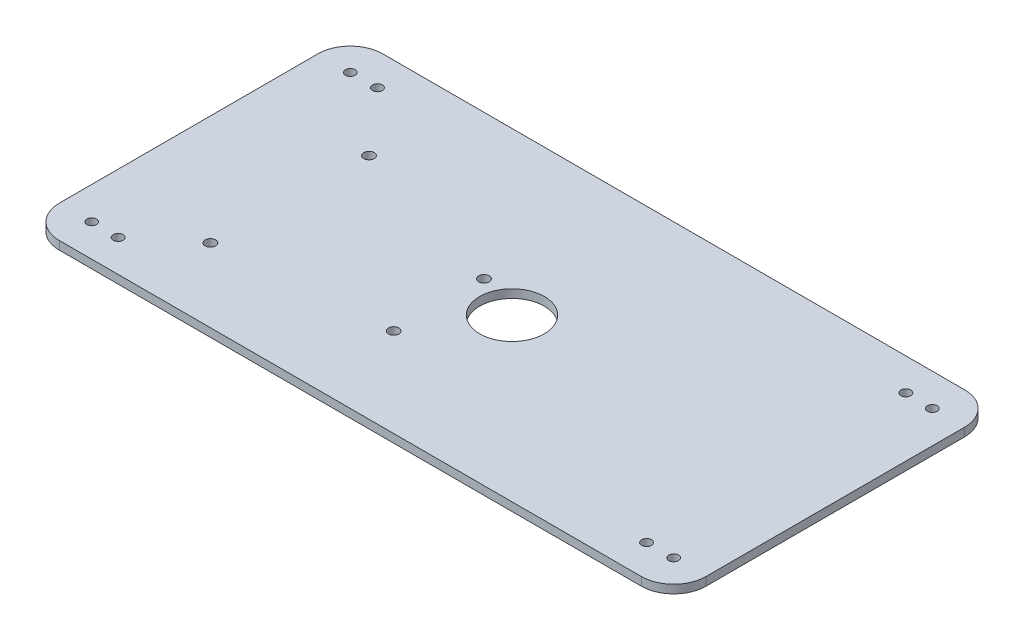
ISO-10303-21;
HEADER;
FILE_DESCRIPTION(('STEP AP214'),'2;1');
FILE_NAME('part.step','',(''),(''),'','','');
FILE_SCHEMA(('AUTOMOTIVE_DESIGN { 1 0 10303 214 1 1 1 1 }'));
ENDSEC;
DATA;
#1=APPLICATION_CONTEXT('core data for automotive mechanical design processes');
#2=APPLICATION_PROTOCOL_DEFINITION('international standard','automotive_design',2000,#1);
#3=PRODUCT_CONTEXT('',#1,'mechanical');
#4=PRODUCT('Part','Part','',(#3));
#5=PRODUCT_RELATED_PRODUCT_CATEGORY('part','',(#4));
#6=PRODUCT_DEFINITION_FORMATION('','',#4);
#7=PRODUCT_DEFINITION_CONTEXT('part definition',#1,'design');
#8=PRODUCT_DEFINITION('design','',#6,#7);
#9=PRODUCT_DEFINITION_SHAPE('','',#8);
#10=(LENGTH_UNIT() NAMED_UNIT(*) SI_UNIT(.MILLI.,.METRE.));
#11=(NAMED_UNIT(*) PLANE_ANGLE_UNIT() SI_UNIT($,.RADIAN.));
#12=(NAMED_UNIT(*) SI_UNIT($,.STERADIAN.) SOLID_ANGLE_UNIT());
#13=UNCERTAINTY_MEASURE_WITH_UNIT(LENGTH_MEASURE(1.E-05),#10,'distance_accuracy_value','');
#14=(GEOMETRIC_REPRESENTATION_CONTEXT(3) GLOBAL_UNCERTAINTY_ASSIGNED_CONTEXT((#13)) GLOBAL_UNIT_ASSIGNED_CONTEXT((#10,
#11,#12)) REPRESENTATION_CONTEXT('',''));
#15=CARTESIAN_POINT('',(0.,0.,0.));
#16=DIRECTION('',(0.,0.,1.));
#17=DIRECTION('',(1.,0.,0.));
#18=AXIS2_PLACEMENT_3D('',#15,#16,#17);
#19=CARTESIAN_POINT('',(0.,2.6,0.));
#20=DIRECTION('',(1.,0.,0.));
#21=DIRECTION('',(0.,0.,-1.));
#22=AXIS2_PLACEMENT_3D('',#19,#20,#21);
#23=PLANE('',#22);
#24=DIRECTION('',(0.,0.,1.));
#25=VECTOR('',#24,1.);
#26=CARTESIAN_POINT('',(0.,2.6,0.));
#27=LINE('',#26,#25);
#28=CARTESIAN_POINT('',(0.,2.6,10.));
#29=VERTEX_POINT('',#28);
#30=CARTESIAN_POINT('',(0.,2.6,90.));
#31=VERTEX_POINT('',#30);
#32=EDGE_CURVE('E121',#29,#31,#27,.T.);
#33=ORIENTED_EDGE('',*,*,#32,.F.);
#34=DIRECTION('',(0.,-1.,0.));
#35=VECTOR('',#34,1.);
#36=CARTESIAN_POINT('',(0.,0.,10.));
#37=LINE('',#36,#35);
#38=CARTESIAN_POINT('',(0.,0.,10.));
#39=VERTEX_POINT('',#38);
#40=EDGE_CURVE('E106',#29,#39,#37,.T.);
#41=ORIENTED_EDGE('',*,*,#40,.T.);
#42=DIRECTION('',(0.,0.,1.));
#43=VECTOR('',#42,1.);
#44=CARTESIAN_POINT('',(0.,0.,0.));
#45=LINE('',#44,#43);
#46=CARTESIAN_POINT('',(0.,0.,90.));
#47=VERTEX_POINT('',#46);
#48=EDGE_CURVE('E118',#39,#47,#45,.T.);
#49=ORIENTED_EDGE('',*,*,#48,.T.);
#50=DIRECTION('',(0.,-1.,0.));
#51=VECTOR('',#50,1.);
#52=CARTESIAN_POINT('',(0.,2.6,90.));
#53=LINE('',#52,#51);
#54=EDGE_CURVE('E123',#47,#31,#53,.F.);
#55=ORIENTED_EDGE('',*,*,#54,.T.);
#56=EDGE_LOOP('',(#33,#41,#49,#55));
#57=FACE_BOUND('',#56,.T.);
#58=ADVANCED_FACE('F35',(#57),#23,.F.);
#59=CARTESIAN_POINT('',(0.,2.6,100.));
#60=DIRECTION('',(0.,0.,-1.));
#61=DIRECTION('',(-1.,0.,0.));
#62=AXIS2_PLACEMENT_3D('',#59,#60,#61);
#63=PLANE('',#62);
#64=DIRECTION('',(1.,0.,0.));
#65=VECTOR('',#64,1.);
#66=CARTESIAN_POINT('',(0.,2.6,100.));
#67=LINE('',#66,#65);
#68=CARTESIAN_POINT('',(10.,2.6,100.));
#69=VERTEX_POINT('',#68);
#70=CARTESIAN_POINT('',(190.,2.6,100.));
#71=VERTEX_POINT('',#70);
#72=EDGE_CURVE('E169',#69,#71,#67,.T.);
#73=ORIENTED_EDGE('',*,*,#72,.F.);
#74=DIRECTION('',(0.,-1.,0.));
#75=VECTOR('',#74,1.);
#76=CARTESIAN_POINT('',(10.,2.6,100.));
#77=LINE('',#76,#75);
#78=CARTESIAN_POINT('',(10.,0.,100.));
#79=VERTEX_POINT('',#78);
#80=EDGE_CURVE('E161',#69,#79,#77,.T.);
#81=ORIENTED_EDGE('',*,*,#80,.T.);
#82=DIRECTION('',(1.,0.,0.));
#83=VECTOR('',#82,1.);
#84=CARTESIAN_POINT('',(0.,0.,100.));
#85=LINE('',#84,#83);
#86=CARTESIAN_POINT('',(190.,0.,100.));
#87=VERTEX_POINT('',#86);
#88=EDGE_CURVE('E127',#79,#87,#85,.T.);
#89=ORIENTED_EDGE('',*,*,#88,.T.);
#90=DIRECTION('',(0.,-1.,0.));
#91=VECTOR('',#90,1.);
#92=CARTESIAN_POINT('',(190.,2.6,100.));
#93=LINE('',#92,#91);
#94=EDGE_CURVE('E159',#87,#71,#93,.F.);
#95=ORIENTED_EDGE('',*,*,#94,.T.);
#96=EDGE_LOOP('',(#73,#81,#89,#95));
#97=FACE_BOUND('',#96,.T.);
#98=ADVANCED_FACE('F167',(#97),#63,.F.);
#99=CARTESIAN_POINT('',(200.,2.6,0.));
#100=DIRECTION('',(1.,0.,0.));
#101=DIRECTION('',(0.,0.,-1.));
#102=AXIS2_PLACEMENT_3D('',#99,#100,#101);
#103=PLANE('',#102);
#104=DIRECTION('',(0.,0.,1.));
#105=VECTOR('',#104,1.);
#106=CARTESIAN_POINT('',(200.,2.6,0.));
#107=LINE('',#106,#105);
#108=CARTESIAN_POINT('',(200.,2.6,10.));
#109=VERTEX_POINT('',#108);
#110=CARTESIAN_POINT('',(200.,2.6,90.));
#111=VERTEX_POINT('',#110);
#112=EDGE_CURVE('E176',#109,#111,#107,.T.);
#113=ORIENTED_EDGE('',*,*,#112,.T.);
#114=DIRECTION('',(0.,-1.,0.));
#115=VECTOR('',#114,1.);
#116=CARTESIAN_POINT('',(200.,0.,90.));
#117=LINE('',#116,#115);
#118=CARTESIAN_POINT('',(200.,0.,90.));
#119=VERTEX_POINT('',#118);
#120=EDGE_CURVE('E11',#111,#119,#117,.T.);
#121=ORIENTED_EDGE('',*,*,#120,.T.);
#122=DIRECTION('',(0.,0.,1.));
#123=VECTOR('',#122,1.);
#124=CARTESIAN_POINT('',(200.,0.,0.));
#125=LINE('',#124,#123);
#126=CARTESIAN_POINT('',(200.,0.,10.));
#127=VERTEX_POINT('',#126);
#128=EDGE_CURVE('E131',#127,#119,#125,.T.);
#129=ORIENTED_EDGE('',*,*,#128,.F.);
#130=DIRECTION('',(0.,-1.,0.));
#131=VECTOR('',#130,1.);
#132=CARTESIAN_POINT('',(200.,2.6,10.));
#133=LINE('',#132,#131);
#134=EDGE_CURVE('E44',#127,#109,#133,.F.);
#135=ORIENTED_EDGE('',*,*,#134,.T.);
#136=EDGE_LOOP('',(#113,#121,#129,#135));
#137=FACE_BOUND('',#136,.T.);
#138=ADVANCED_FACE('F175',(#137),#103,.T.);
#139=CARTESIAN_POINT('',(0.,2.6,0.));
#140=DIRECTION('',(0.,0.,-1.));
#141=DIRECTION('',(-1.,0.,0.));
#142=AXIS2_PLACEMENT_3D('',#139,#140,#141);
#143=PLANE('',#142);
#144=DIRECTION('',(1.,0.,0.));
#145=VECTOR('',#144,1.);
#146=CARTESIAN_POINT('',(0.,0.,0.));
#147=LINE('',#146,#145);
#148=CARTESIAN_POINT('',(10.,0.,0.));
#149=VERTEX_POINT('',#148);
#150=CARTESIAN_POINT('',(190.,0.,0.));
#151=VERTEX_POINT('',#150);
#152=EDGE_CURVE('E142',#149,#151,#147,.T.);
#153=ORIENTED_EDGE('',*,*,#152,.F.);
#154=DIRECTION('',(0.,-1.,0.));
#155=VECTOR('',#154,1.);
#156=CARTESIAN_POINT('',(10.,2.6,0.));
#157=LINE('',#156,#155);
#158=CARTESIAN_POINT('',(10.,2.6,0.));
#159=VERTEX_POINT('',#158);
#160=EDGE_CURVE('E107',#149,#159,#157,.F.);
#161=ORIENTED_EDGE('',*,*,#160,.T.);
#162=DIRECTION('',(1.,0.,0.));
#163=VECTOR('',#162,1.);
#164=CARTESIAN_POINT('',(0.,2.6,0.));
#165=LINE('',#164,#163);
#166=CARTESIAN_POINT('',(190.,2.6,0.));
#167=VERTEX_POINT('',#166);
#168=EDGE_CURVE('E137',#159,#167,#165,.T.);
#169=ORIENTED_EDGE('',*,*,#168,.T.);
#170=DIRECTION('',(0.,-1.,0.));
#171=VECTOR('',#170,1.);
#172=CARTESIAN_POINT('',(190.,2.6,0.));
#173=LINE('',#172,#171);
#174=EDGE_CURVE('E112',#167,#151,#173,.T.);
#175=ORIENTED_EDGE('',*,*,#174,.T.);
#176=EDGE_LOOP('',(#153,#161,#169,#175));
#177=FACE_BOUND('',#176,.T.);
#178=ADVANCED_FACE('F433',(#177),#143,.T.);
#179=CARTESIAN_POINT('',(0.,2.6,0.));
#180=DIRECTION('',(0.,1.,0.));
#181=DIRECTION('',(0.,0.,1.));
#182=AXIS2_PLACEMENT_3D('',#179,#180,#181);
#183=PLANE('',#182);
#184=CARTESIAN_POINT('',(18.288,2.6,90.094));
#185=DIRECTION('',(0.,-1.,0.));
#186=DIRECTION('',(0.,0.,-1.));
#187=AXIS2_PLACEMENT_3D('',#184,#185,#186);
#188=CIRCLE('',#187,1.524);
#189=CARTESIAN_POINT('',(18.288,2.6,88.57));
#190=VERTEX_POINT('',#189);
#191=EDGE_CURVE('E248',#190,#190,#188,.T.);
#192=ORIENTED_EDGE('',*,*,#191,.T.);
#193=EDGE_LOOP('',(#192));
#194=FACE_BOUND('',#193,.T.);
#195=CARTESIAN_POINT('',(181.712,2.6,90.094));
#196=DIRECTION('',(0.,1.,0.));
#197=DIRECTION('',(0.,0.,-1.));
#198=AXIS2_PLACEMENT_3D('',#195,#196,#197);
#199=CIRCLE('',#198,1.524);
#200=CARTESIAN_POINT('',(181.712,2.6,88.57));
#201=VERTEX_POINT('',#200);
#202=EDGE_CURVE('E242',#201,#201,#199,.T.);
#203=ORIENTED_EDGE('',*,*,#202,.F.);
#204=EDGE_LOOP('',(#203));
#205=FACE_BOUND('',#204,.T.);
#206=CARTESIAN_POINT('',(181.712,2.6,9.90599999999999));
#207=DIRECTION('',(0.,-1.,0.));
#208=DIRECTION('',(0.,0.,1.));
#209=AXIS2_PLACEMENT_3D('',#206,#207,#208);
#210=CIRCLE('',#209,1.524);
#211=CARTESIAN_POINT('',(181.712,2.6,11.43));
#212=VERTEX_POINT('',#211);
#213=EDGE_CURVE('E236',#212,#212,#210,.T.);
#214=ORIENTED_EDGE('',*,*,#213,.T.);
#215=EDGE_LOOP('',(#214));
#216=FACE_BOUND('',#215,.T.);
#217=CARTESIAN_POINT('',(18.288,2.6,9.906));
#218=DIRECTION('',(0.,1.,0.));
#219=DIRECTION('',(0.,0.,1.));
#220=AXIS2_PLACEMENT_3D('',#217,#218,#219);
#221=CIRCLE('',#220,1.524);
#222=CARTESIAN_POINT('',(18.288,2.6,11.43));
#223=VERTEX_POINT('',#222);
#224=EDGE_CURVE('E230',#223,#223,#221,.T.);
#225=ORIENTED_EDGE('',*,*,#224,.F.);
#226=EDGE_LOOP('',(#225));
#227=FACE_BOUND('',#226,.T.);
#228=CARTESIAN_POINT('',(100.,2.6,50.));
#229=DIRECTION('',(0.,-1.,0.));
#230=DIRECTION('',(0.,0.,-1.));
#231=AXIS2_PLACEMENT_3D('',#228,#229,#230);
#232=CIRCLE('',#231,9.99999999999999);
#233=CARTESIAN_POINT('',(100.,2.6,40.));
#234=VERTEX_POINT('',#233);
#235=EDGE_CURVE('E221',#234,#234,#232,.T.);
#236=ORIENTED_EDGE('',*,*,#235,.T.);
#237=EDGE_LOOP('',(#236));
#238=FACE_BOUND('',#237,.T.);
#239=CARTESIAN_POINT('',(85.94475,2.6,72.53875));
#240=DIRECTION('',(0.,1.,0.));
#241=DIRECTION('',(0.,0.,1.));
#242=AXIS2_PLACEMENT_3D('',#239,#240,#241);
#243=CIRCLE('',#242,1.61925);
#244=CARTESIAN_POINT('',(85.94475,2.6,74.158));
#245=VERTEX_POINT('',#244);
#246=EDGE_CURVE('E218',#245,#245,#243,.T.);
#247=ORIENTED_EDGE('',*,*,#246,.F.);
#248=EDGE_LOOP('',(#247));
#249=FACE_BOUND('',#248,.T.);
#250=CARTESIAN_POINT('',(34.01445,2.6,77.28855));
#251=DIRECTION('',(0.,1.,0.));
#252=DIRECTION('',(0.,0.,1.));
#253=AXIS2_PLACEMENT_3D('',#250,#251,#252);
#254=CIRCLE('',#253,1.61925);
#255=CARTESIAN_POINT('',(34.01445,2.6,78.9078));
#256=VERTEX_POINT('',#255);
#257=EDGE_CURVE('E212',#256,#256,#254,.T.);
#258=ORIENTED_EDGE('',*,*,#257,.F.);
#259=EDGE_LOOP('',(#258));
#260=FACE_BOUND('',#259,.T.);
#261=CARTESIAN_POINT('',(85.94475,2.6,44.61145));
#262=DIRECTION('',(0.,1.,0.));
#263=DIRECTION('',(0.,0.,1.));
#264=AXIS2_PLACEMENT_3D('',#261,#262,#263);
#265=CIRCLE('',#264,1.61925);
#266=CARTESIAN_POINT('',(85.94475,2.6,46.2307));
#267=VERTEX_POINT('',#266);
#268=EDGE_CURVE('E206',#267,#267,#265,.T.);
#269=ORIENTED_EDGE('',*,*,#268,.F.);
#270=EDGE_LOOP('',(#269));
#271=FACE_BOUND('',#270,.T.);
#272=CARTESIAN_POINT('',(35.15745,2.6,29.37145));
#273=DIRECTION('',(0.,1.,0.));
#274=DIRECTION('',(0.,0.,1.));
#275=AXIS2_PLACEMENT_3D('',#272,#273,#274);
#276=CIRCLE('',#275,1.61924999999999);
#277=CARTESIAN_POINT('',(35.15745,2.6,30.9907));
#278=VERTEX_POINT('',#277);
#279=EDGE_CURVE('E202',#278,#278,#276,.T.);
#280=ORIENTED_EDGE('',*,*,#279,.F.);
#281=EDGE_LOOP('',(#280));
#282=FACE_BOUND('',#281,.T.);
#283=CARTESIAN_POINT('',(190.,2.6,90.));
#284=DIRECTION('',(0.,1.,0.));
#285=DIRECTION('',(0.,0.,1.));
#286=AXIS2_PLACEMENT_3D('',#283,#284,#285);
#287=CIRCLE('',#286,1.5);
#288=CARTESIAN_POINT('',(190.,2.6,91.5));
#289=VERTEX_POINT('',#288);
#290=EDGE_CURVE('E194',#289,#289,#287,.T.);
#291=ORIENTED_EDGE('',*,*,#290,.F.);
#292=EDGE_LOOP('',(#291));
#293=FACE_BOUND('',#292,.T.);
#294=CARTESIAN_POINT('',(10.,2.6,90.));
#295=DIRECTION('',(0.,-1.,0.));
#296=DIRECTION('',(0.,0.,1.));
#297=AXIS2_PLACEMENT_3D('',#294,#295,#296);
#298=CIRCLE('',#297,1.5);
#299=CARTESIAN_POINT('',(10.,2.6,91.5));
#300=VERTEX_POINT('',#299);
#301=EDGE_CURVE('E188',#300,#300,#298,.T.);
#302=ORIENTED_EDGE('',*,*,#301,.T.);
#303=EDGE_LOOP('',(#302));
#304=FACE_BOUND('',#303,.T.);
#305=CARTESIAN_POINT('',(10.,2.6,10.));
#306=DIRECTION('',(0.,1.,0.));
#307=DIRECTION('',(0.,0.,-1.));
#308=AXIS2_PLACEMENT_3D('',#305,#306,#307);
#309=CIRCLE('',#308,1.5);
#310=CARTESIAN_POINT('',(10.,2.6,8.50000000000001));
#311=VERTEX_POINT('',#310);
#312=EDGE_CURVE('E183',#311,#311,#309,.T.);
#313=ORIENTED_EDGE('',*,*,#312,.F.);
#314=EDGE_LOOP('',(#313));
#315=FACE_BOUND('',#314,.T.);
#316=CARTESIAN_POINT('',(190.,2.6,10.));
#317=DIRECTION('',(0.,-1.,0.));
#318=DIRECTION('',(0.,0.,-1.));
#319=AXIS2_PLACEMENT_3D('',#316,#317,#318);
#320=CIRCLE('',#319,1.5);
#321=CARTESIAN_POINT('',(190.,2.6,8.5));
#322=VERTEX_POINT('',#321);
#323=EDGE_CURVE('E128',#322,#322,#320,.T.);
#324=ORIENTED_EDGE('',*,*,#323,.T.);
#325=EDGE_LOOP('',(#324));
#326=FACE_BOUND('',#325,.T.);
#327=ORIENTED_EDGE('',*,*,#168,.F.);
#328=CARTESIAN_POINT('',(10.,2.6,10.));
#329=DIRECTION('',(0.,1.,0.));
#330=DIRECTION('',(0.,0.,1.));
#331=AXIS2_PLACEMENT_3D('',#328,#329,#330);
#332=CIRCLE('',#331,10.);
#333=EDGE_CURVE('E157',#159,#29,#332,.T.);
#334=ORIENTED_EDGE('',*,*,#333,.T.);
#335=ORIENTED_EDGE('',*,*,#32,.T.);
#336=CARTESIAN_POINT('',(10.,2.6,90.));
#337=DIRECTION('',(0.,1.,0.));
#338=DIRECTION('',(0.,0.,1.));
#339=AXIS2_PLACEMENT_3D('',#336,#337,#338);
#340=CIRCLE('',#339,10.);
#341=EDGE_CURVE('E155',#31,#69,#340,.T.);
#342=ORIENTED_EDGE('',*,*,#341,.T.);
#343=ORIENTED_EDGE('',*,*,#72,.T.);
#344=CARTESIAN_POINT('',(190.,2.6,90.));
#345=DIRECTION('',(0.,1.,0.));
#346=DIRECTION('',(0.,0.,1.));
#347=AXIS2_PLACEMENT_3D('',#344,#345,#346);
#348=CIRCLE('',#347,10.);
#349=EDGE_CURVE('E51',#71,#111,#348,.T.);
#350=ORIENTED_EDGE('',*,*,#349,.T.);
#351=ORIENTED_EDGE('',*,*,#112,.F.);
#352=CARTESIAN_POINT('',(190.,2.6,10.));
#353=DIRECTION('',(0.,1.,0.));
#354=DIRECTION('',(0.,0.,1.));
#355=AXIS2_PLACEMENT_3D('',#352,#353,#354);
#356=CIRCLE('',#355,10.);
#357=EDGE_CURVE('E152',#109,#167,#356,.T.);
#358=ORIENTED_EDGE('',*,*,#357,.T.);
#359=EDGE_LOOP('',(#327,#334,#335,#342,#343,#350,#351,#358));
#360=FACE_BOUND('',#359,.T.);
#361=ADVANCED_FACE('F259',(#194,#205,#216,#227,#238,#249,#260,#271,#282,#293,#304,#315,#326,
#360),#183,.T.);
#362=CARTESIAN_POINT('',(0.,0.,0.));
#363=DIRECTION('',(0.,1.,0.));
#364=DIRECTION('',(0.,0.,1.));
#365=AXIS2_PLACEMENT_3D('',#362,#363,#364);
#366=PLANE('',#365);
#367=CARTESIAN_POINT('',(18.288,1.19999999954185E-07,90.094));
#368=DIRECTION('',(0.,-1.,0.));
#369=DIRECTION('',(0.,0.,-1.));
#370=AXIS2_PLACEMENT_3D('',#367,#368,#369);
#371=CIRCLE('',#370,1.524);
#372=CARTESIAN_POINT('',(18.288,1.19999999954185E-07,88.57));
#373=VERTEX_POINT('',#372);
#374=EDGE_CURVE('E245',#373,#373,#371,.T.);
#375=ORIENTED_EDGE('',*,*,#374,.F.);
#376=EDGE_LOOP('',(#375));
#377=FACE_BOUND('',#376,.T.);
#378=CARTESIAN_POINT('',(181.712,1.19999999954185E-07,90.094));
#379=DIRECTION('',(0.,1.,0.));
#380=DIRECTION('',(0.,0.,-1.));
#381=AXIS2_PLACEMENT_3D('',#378,#379,#380);
#382=CIRCLE('',#381,1.524);
#383=CARTESIAN_POINT('',(181.712,1.19999999954185E-07,88.57));
#384=VERTEX_POINT('',#383);
#385=EDGE_CURVE('E239',#384,#384,#382,.T.);
#386=ORIENTED_EDGE('',*,*,#385,.T.);
#387=EDGE_LOOP('',(#386));
#388=FACE_BOUND('',#387,.T.);
#389=CARTESIAN_POINT('',(181.712,1.19999999954185E-07,9.90599999999999));
#390=DIRECTION('',(0.,-1.,0.));
#391=DIRECTION('',(0.,0.,1.));
#392=AXIS2_PLACEMENT_3D('',#389,#390,#391);
#393=CIRCLE('',#392,1.524);
#394=CARTESIAN_POINT('',(181.712,1.19999999954185E-07,11.43));
#395=VERTEX_POINT('',#394);
#396=EDGE_CURVE('E233',#395,#395,#393,.T.);
#397=ORIENTED_EDGE('',*,*,#396,.F.);
#398=EDGE_LOOP('',(#397));
#399=FACE_BOUND('',#398,.T.);
#400=CARTESIAN_POINT('',(18.288,1.19999999954185E-07,9.906));
#401=DIRECTION('',(0.,1.,0.));
#402=DIRECTION('',(0.,0.,1.));
#403=AXIS2_PLACEMENT_3D('',#400,#401,#402);
#404=CIRCLE('',#403,1.524);
#405=CARTESIAN_POINT('',(18.288,1.19999999954185E-07,11.43));
#406=VERTEX_POINT('',#405);
#407=EDGE_CURVE('E227',#406,#406,#404,.T.);
#408=ORIENTED_EDGE('',*,*,#407,.T.);
#409=EDGE_LOOP('',(#408));
#410=FACE_BOUND('',#409,.T.);
#411=CARTESIAN_POINT('',(100.,0.,50.));
#412=DIRECTION('',(0.,-1.,0.));
#413=DIRECTION('',(0.,0.,-1.));
#414=AXIS2_PLACEMENT_3D('',#411,#412,#413);
#415=CIRCLE('',#414,9.99999999999999);
#416=CARTESIAN_POINT('',(100.,0.,40.));
#417=VERTEX_POINT('',#416);
#418=EDGE_CURVE('E224',#417,#417,#415,.T.);
#419=ORIENTED_EDGE('',*,*,#418,.F.);
#420=EDGE_LOOP('',(#419));
#421=FACE_BOUND('',#420,.T.);
#422=CARTESIAN_POINT('',(85.94475,0.,72.53875));
#423=DIRECTION('',(0.,1.,0.));
#424=DIRECTION('',(0.,0.,1.));
#425=AXIS2_PLACEMENT_3D('',#422,#423,#424);
#426=CIRCLE('',#425,1.61925);
#427=CARTESIAN_POINT('',(85.94475,0.,74.158));
#428=VERTEX_POINT('',#427);
#429=EDGE_CURVE('E215',#428,#428,#426,.T.);
#430=ORIENTED_EDGE('',*,*,#429,.T.);
#431=EDGE_LOOP('',(#430));
#432=FACE_BOUND('',#431,.T.);
#433=CARTESIAN_POINT('',(34.01445,0.,77.28855));
#434=DIRECTION('',(0.,1.,0.));
#435=DIRECTION('',(0.,0.,1.));
#436=AXIS2_PLACEMENT_3D('',#433,#434,#435);
#437=CIRCLE('',#436,1.61925);
#438=CARTESIAN_POINT('',(34.01445,0.,78.9078));
#439=VERTEX_POINT('',#438);
#440=EDGE_CURVE('E209',#439,#439,#437,.T.);
#441=ORIENTED_EDGE('',*,*,#440,.T.);
#442=EDGE_LOOP('',(#441));
#443=FACE_BOUND('',#442,.T.);
#444=CARTESIAN_POINT('',(85.94475,0.,44.61145));
#445=DIRECTION('',(0.,1.,0.));
#446=DIRECTION('',(0.,0.,1.));
#447=AXIS2_PLACEMENT_3D('',#444,#445,#446);
#448=CIRCLE('',#447,1.61925);
#449=CARTESIAN_POINT('',(85.94475,0.,46.2307));
#450=VERTEX_POINT('',#449);
#451=EDGE_CURVE('E205',#450,#450,#448,.T.);
#452=ORIENTED_EDGE('',*,*,#451,.T.);
#453=EDGE_LOOP('',(#452));
#454=FACE_BOUND('',#453,.T.);
#455=CARTESIAN_POINT('',(35.15745,0.,29.37145));
#456=DIRECTION('',(0.,1.,0.));
#457=DIRECTION('',(0.,0.,1.));
#458=AXIS2_PLACEMENT_3D('',#455,#456,#457);
#459=CIRCLE('',#458,1.61924999999999);
#460=CARTESIAN_POINT('',(35.15745,0.,30.9907));
#461=VERTEX_POINT('',#460);
#462=EDGE_CURVE('E39',#461,#461,#459,.T.);
#463=ORIENTED_EDGE('',*,*,#462,.T.);
#464=EDGE_LOOP('',(#463));
#465=FACE_BOUND('',#464,.T.);
#466=CARTESIAN_POINT('',(190.,0.,90.));
#467=DIRECTION('',(0.,1.,0.));
#468=DIRECTION('',(0.,0.,1.));
#469=AXIS2_PLACEMENT_3D('',#466,#467,#468);
#470=CIRCLE('',#469,1.5);
#471=CARTESIAN_POINT('',(190.,0.,91.5));
#472=VERTEX_POINT('',#471);
#473=EDGE_CURVE('E197',#472,#472,#470,.T.);
#474=ORIENTED_EDGE('',*,*,#473,.T.);
#475=EDGE_LOOP('',(#474));
#476=FACE_BOUND('',#475,.T.);
#477=CARTESIAN_POINT('',(10.,0.,90.));
#478=DIRECTION('',(0.,-1.,0.));
#479=DIRECTION('',(0.,0.,1.));
#480=AXIS2_PLACEMENT_3D('',#477,#478,#479);
#481=CIRCLE('',#480,1.5);
#482=CARTESIAN_POINT('',(10.,0.,91.5));
#483=VERTEX_POINT('',#482);
#484=EDGE_CURVE('E191',#483,#483,#481,.T.);
#485=ORIENTED_EDGE('',*,*,#484,.F.);
#486=EDGE_LOOP('',(#485));
#487=FACE_BOUND('',#486,.T.);
#488=CARTESIAN_POINT('',(10.,0.,10.));
#489=DIRECTION('',(0.,1.,0.));
#490=DIRECTION('',(0.,0.,-1.));
#491=AXIS2_PLACEMENT_3D('',#488,#489,#490);
#492=CIRCLE('',#491,1.5);
#493=CARTESIAN_POINT('',(10.,0.,8.50000000000001));
#494=VERTEX_POINT('',#493);
#495=EDGE_CURVE('E185',#494,#494,#492,.T.);
#496=ORIENTED_EDGE('',*,*,#495,.T.);
#497=EDGE_LOOP('',(#496));
#498=FACE_BOUND('',#497,.T.);
#499=CARTESIAN_POINT('',(190.,0.,10.));
#500=DIRECTION('',(0.,-1.,0.));
#501=DIRECTION('',(0.,0.,-1.));
#502=AXIS2_PLACEMENT_3D('',#499,#500,#501);
#503=CIRCLE('',#502,1.5);
#504=CARTESIAN_POINT('',(190.,0.,8.5));
#505=VERTEX_POINT('',#504);
#506=EDGE_CURVE('E134',#505,#505,#503,.T.);
#507=ORIENTED_EDGE('',*,*,#506,.F.);
#508=EDGE_LOOP('',(#507));
#509=FACE_BOUND('',#508,.T.);
#510=ORIENTED_EDGE('',*,*,#48,.F.);
#511=CARTESIAN_POINT('',(10.,0.,10.));
#512=DIRECTION('',(0.,1.,0.));
#513=DIRECTION('',(0.,0.,1.));
#514=AXIS2_PLACEMENT_3D('',#511,#512,#513);
#515=CIRCLE('',#514,10.);
#516=EDGE_CURVE('E102',#39,#149,#515,.F.);
#517=ORIENTED_EDGE('',*,*,#516,.T.);
#518=ORIENTED_EDGE('',*,*,#152,.T.);
#519=CARTESIAN_POINT('',(190.,0.,10.));
#520=DIRECTION('',(0.,1.,0.));
#521=DIRECTION('',(0.,0.,1.));
#522=AXIS2_PLACEMENT_3D('',#519,#520,#521);
#523=CIRCLE('',#522,10.);
#524=EDGE_CURVE('E122',#151,#127,#523,.F.);
#525=ORIENTED_EDGE('',*,*,#524,.T.);
#526=ORIENTED_EDGE('',*,*,#128,.T.);
#527=CARTESIAN_POINT('',(190.,0.,90.));
#528=DIRECTION('',(0.,1.,0.));
#529=DIRECTION('',(0.,0.,1.));
#530=AXIS2_PLACEMENT_3D('',#527,#528,#529);
#531=CIRCLE('',#530,10.);
#532=EDGE_CURVE('E146',#119,#87,#531,.F.);
#533=ORIENTED_EDGE('',*,*,#532,.T.);
#534=ORIENTED_EDGE('',*,*,#88,.F.);
#535=CARTESIAN_POINT('',(10.,0.,90.));
#536=DIRECTION('',(0.,1.,0.));
#537=DIRECTION('',(0.,0.,1.));
#538=AXIS2_PLACEMENT_3D('',#535,#536,#537);
#539=CIRCLE('',#538,10.);
#540=EDGE_CURVE('E113',#79,#47,#539,.F.);
#541=ORIENTED_EDGE('',*,*,#540,.T.);
#542=EDGE_LOOP('',(#510,#517,#518,#525,#526,#533,#534,#541));
#543=FACE_BOUND('',#542,.T.);
#544=ADVANCED_FACE('F125',(#377,#388,#399,#410,#421,#432,#443,#454,#465,#476,#487,#498,#509,
#543),#366,.F.);
#545=CARTESIAN_POINT('',(10.,2.6,10.));
#546=DIRECTION('',(0.,1.,0.));
#547=DIRECTION('',(0.,0.,1.));
#548=AXIS2_PLACEMENT_3D('',#545,#546,#547);
#549=CYLINDRICAL_SURFACE('',#548,10.);
#550=ORIENTED_EDGE('',*,*,#333,.F.);
#551=ORIENTED_EDGE('',*,*,#160,.F.);
#552=ORIENTED_EDGE('',*,*,#516,.F.);
#553=ORIENTED_EDGE('',*,*,#40,.F.);
#554=EDGE_LOOP('',(#550,#551,#552,#553));
#555=FACE_BOUND('',#554,.T.);
#556=ADVANCED_FACE('F105',(#555),#549,.T.);
#557=CARTESIAN_POINT('',(10.,2.6,90.));
#558=DIRECTION('',(0.,-1.,0.));
#559=DIRECTION('',(0.,0.,-1.));
#560=AXIS2_PLACEMENT_3D('',#557,#558,#559);
#561=CYLINDRICAL_SURFACE('',#560,10.);
#562=ORIENTED_EDGE('',*,*,#341,.F.);
#563=ORIENTED_EDGE('',*,*,#54,.F.);
#564=ORIENTED_EDGE('',*,*,#540,.F.);
#565=ORIENTED_EDGE('',*,*,#80,.F.);
#566=EDGE_LOOP('',(#562,#563,#564,#565));
#567=FACE_BOUND('',#566,.T.);
#568=ADVANCED_FACE('F311',(#567),#561,.T.);
#569=CARTESIAN_POINT('',(190.,2.6,90.));
#570=DIRECTION('',(0.,1.,0.));
#571=DIRECTION('',(0.,0.,1.));
#572=AXIS2_PLACEMENT_3D('',#569,#570,#571);
#573=CYLINDRICAL_SURFACE('',#572,10.);
#574=ORIENTED_EDGE('',*,*,#349,.F.);
#575=ORIENTED_EDGE('',*,*,#94,.F.);
#576=ORIENTED_EDGE('',*,*,#532,.F.);
#577=ORIENTED_EDGE('',*,*,#120,.F.);
#578=EDGE_LOOP('',(#574,#575,#576,#577));
#579=FACE_BOUND('',#578,.T.);
#580=ADVANCED_FACE('F174',(#579),#573,.T.);
#581=CARTESIAN_POINT('',(190.,2.6,10.));
#582=DIRECTION('',(0.,-1.,0.));
#583=DIRECTION('',(0.,0.,-1.));
#584=AXIS2_PLACEMENT_3D('',#581,#582,#583);
#585=CYLINDRICAL_SURFACE('',#584,10.);
#586=ORIENTED_EDGE('',*,*,#357,.F.);
#587=ORIENTED_EDGE('',*,*,#134,.F.);
#588=ORIENTED_EDGE('',*,*,#524,.F.);
#589=ORIENTED_EDGE('',*,*,#174,.F.);
#590=EDGE_LOOP('',(#586,#587,#588,#589));
#591=FACE_BOUND('',#590,.T.);
#592=ADVANCED_FACE('F37',(#591),#585,.T.);
#593=CARTESIAN_POINT('',(190.,2.6,10.));
#594=DIRECTION('',(0.,-1.,0.));
#595=DIRECTION('',(0.,0.,-1.));
#596=AXIS2_PLACEMENT_3D('',#593,#594,#595);
#597=CYLINDRICAL_SURFACE('',#596,1.5);
#598=ORIENTED_EDGE('',*,*,#323,.F.);
#599=EDGE_LOOP('',(#598));
#600=FACE_BOUND('',#599,.T.);
#601=ORIENTED_EDGE('',*,*,#506,.T.);
#602=EDGE_LOOP('',(#601));
#603=FACE_BOUND('',#602,.T.);
#604=ADVANCED_FACE('F286',(#600,#603),#597,.F.);
#605=CARTESIAN_POINT('',(10.,2.6,10.));
#606=DIRECTION('',(0.,-1.,0.));
#607=DIRECTION('',(0.,0.,-1.));
#608=AXIS2_PLACEMENT_3D('',#605,#606,#607);
#609=CYLINDRICAL_SURFACE('',#608,1.5);
#610=ORIENTED_EDGE('',*,*,#312,.T.);
#611=EDGE_LOOP('',(#610));
#612=FACE_BOUND('',#611,.T.);
#613=ORIENTED_EDGE('',*,*,#495,.F.);
#614=EDGE_LOOP('',(#613));
#615=FACE_BOUND('',#614,.T.);
#616=ADVANCED_FACE('F288',(#612,#615),#609,.F.);
#617=CARTESIAN_POINT('',(10.,2.6,90.));
#618=DIRECTION('',(0.,-1.,0.));
#619=DIRECTION('',(0.,0.,-1.));
#620=AXIS2_PLACEMENT_3D('',#617,#618,#619);
#621=CYLINDRICAL_SURFACE('',#620,1.5);
#622=ORIENTED_EDGE('',*,*,#301,.F.);
#623=EDGE_LOOP('',(#622));
#624=FACE_BOUND('',#623,.T.);
#625=ORIENTED_EDGE('',*,*,#484,.T.);
#626=EDGE_LOOP('',(#625));
#627=FACE_BOUND('',#626,.T.);
#628=ADVANCED_FACE('F295',(#624,#627),#621,.F.);
#629=CARTESIAN_POINT('',(190.,2.6,90.));
#630=DIRECTION('',(0.,-1.,0.));
#631=DIRECTION('',(0.,0.,-1.));
#632=AXIS2_PLACEMENT_3D('',#629,#630,#631);
#633=CYLINDRICAL_SURFACE('',#632,1.5);
#634=ORIENTED_EDGE('',*,*,#290,.T.);
#635=EDGE_LOOP('',(#634));
#636=FACE_BOUND('',#635,.T.);
#637=ORIENTED_EDGE('',*,*,#473,.F.);
#638=EDGE_LOOP('',(#637));
#639=FACE_BOUND('',#638,.T.);
#640=ADVANCED_FACE('F341',(#636,#639),#633,.F.);
#641=CARTESIAN_POINT('',(35.15745,-7.4,29.37145));
#642=DIRECTION('',(0.,1.,0.));
#643=DIRECTION('',(0.,0.,1.));
#644=AXIS2_PLACEMENT_3D('',#641,#642,#643);
#645=CYLINDRICAL_SURFACE('',#644,1.61924999999999);
#646=ORIENTED_EDGE('',*,*,#279,.T.);
#647=EDGE_LOOP('',(#646));
#648=FACE_BOUND('',#647,.T.);
#649=ORIENTED_EDGE('',*,*,#462,.F.);
#650=EDGE_LOOP('',(#649));
#651=FACE_BOUND('',#650,.T.);
#652=ADVANCED_FACE('F351',(#648,#651),#645,.F.);
#653=CARTESIAN_POINT('',(85.94475,0.,44.61145));
#654=DIRECTION('',(0.,1.,0.));
#655=DIRECTION('',(0.,0.,1.));
#656=AXIS2_PLACEMENT_3D('',#653,#654,#655);
#657=CYLINDRICAL_SURFACE('',#656,1.61925);
#658=ORIENTED_EDGE('',*,*,#451,.F.);
#659=EDGE_LOOP('',(#658));
#660=FACE_BOUND('',#659,.T.);
#661=ORIENTED_EDGE('',*,*,#268,.T.);
#662=EDGE_LOOP('',(#661));
#663=FACE_BOUND('',#662,.T.);
#664=ADVANCED_FACE('F361',(#660,#663),#657,.F.);
#665=CARTESIAN_POINT('',(34.01445,0.,77.28855));
#666=DIRECTION('',(0.,1.,0.));
#667=DIRECTION('',(0.,0.,1.));
#668=AXIS2_PLACEMENT_3D('',#665,#666,#667);
#669=CYLINDRICAL_SURFACE('',#668,1.61925);
#670=ORIENTED_EDGE('',*,*,#440,.F.);
#671=EDGE_LOOP('',(#670));
#672=FACE_BOUND('',#671,.T.);
#673=ORIENTED_EDGE('',*,*,#257,.T.);
#674=EDGE_LOOP('',(#673));
#675=FACE_BOUND('',#674,.T.);
#676=ADVANCED_FACE('F371',(#672,#675),#669,.F.);
#677=CARTESIAN_POINT('',(85.94475,0.,72.53875));
#678=DIRECTION('',(0.,1.,0.));
#679=DIRECTION('',(0.,0.,1.));
#680=AXIS2_PLACEMENT_3D('',#677,#678,#679);
#681=CYLINDRICAL_SURFACE('',#680,1.61925);
#682=ORIENTED_EDGE('',*,*,#429,.F.);
#683=EDGE_LOOP('',(#682));
#684=FACE_BOUND('',#683,.T.);
#685=ORIENTED_EDGE('',*,*,#246,.T.);
#686=EDGE_LOOP('',(#685));
#687=FACE_BOUND('',#686,.T.);
#688=ADVANCED_FACE('F381',(#684,#687),#681,.F.);
#689=CARTESIAN_POINT('',(100.,2.6,50.));
#690=DIRECTION('',(0.,-1.,0.));
#691=DIRECTION('',(0.,0.,-1.));
#692=AXIS2_PLACEMENT_3D('',#689,#690,#691);
#693=CYLINDRICAL_SURFACE('',#692,9.99999999999999);
#694=ORIENTED_EDGE('',*,*,#235,.F.);
#695=EDGE_LOOP('',(#694));
#696=FACE_BOUND('',#695,.T.);
#697=ORIENTED_EDGE('',*,*,#418,.T.);
#698=EDGE_LOOP('',(#697));
#699=FACE_BOUND('',#698,.T.);
#700=ADVANCED_FACE('F391',(#696,#699),#693,.F.);
#701=CARTESIAN_POINT('',(18.288,1.19999999954185E-07,9.906));
#702=DIRECTION('',(0.,1.,0.));
#703=DIRECTION('',(0.,0.,1.));
#704=AXIS2_PLACEMENT_3D('',#701,#702,#703);
#705=CYLINDRICAL_SURFACE('',#704,1.524);
#706=ORIENTED_EDGE('',*,*,#407,.F.);
#707=EDGE_LOOP('',(#706));
#708=FACE_BOUND('',#707,.T.);
#709=ORIENTED_EDGE('',*,*,#224,.T.);
#710=EDGE_LOOP('',(#709));
#711=FACE_BOUND('',#710,.T.);
#712=ADVANCED_FACE('F401',(#708,#711),#705,.F.);
#713=CARTESIAN_POINT('',(181.712,1.19999999954185E-07,9.90599999999999));
#714=DIRECTION('',(0.,1.,0.));
#715=DIRECTION('',(0.,0.,1.));
#716=AXIS2_PLACEMENT_3D('',#713,#714,#715);
#717=CYLINDRICAL_SURFACE('',#716,1.524);
#718=ORIENTED_EDGE('',*,*,#396,.T.);
#719=EDGE_LOOP('',(#718));
#720=FACE_BOUND('',#719,.T.);
#721=ORIENTED_EDGE('',*,*,#213,.F.);
#722=EDGE_LOOP('',(#721));
#723=FACE_BOUND('',#722,.T.);
#724=ADVANCED_FACE('F411',(#720,#723),#717,.F.);
#725=CARTESIAN_POINT('',(181.712,1.19999999954185E-07,90.094));
#726=DIRECTION('',(0.,1.,0.));
#727=DIRECTION('',(0.,0.,1.));
#728=AXIS2_PLACEMENT_3D('',#725,#726,#727);
#729=CYLINDRICAL_SURFACE('',#728,1.524);
#730=ORIENTED_EDGE('',*,*,#385,.F.);
#731=EDGE_LOOP('',(#730));
#732=FACE_BOUND('',#731,.T.);
#733=ORIENTED_EDGE('',*,*,#202,.T.);
#734=EDGE_LOOP('',(#733));
#735=FACE_BOUND('',#734,.T.);
#736=ADVANCED_FACE('F421',(#732,#735),#729,.F.);
#737=CARTESIAN_POINT('',(18.288,1.19999999954185E-07,90.094));
#738=DIRECTION('',(0.,1.,0.));
#739=DIRECTION('',(0.,0.,1.));
#740=AXIS2_PLACEMENT_3D('',#737,#738,#739);
#741=CYLINDRICAL_SURFACE('',#740,1.524);
#742=ORIENTED_EDGE('',*,*,#374,.T.);
#743=EDGE_LOOP('',(#742));
#744=FACE_BOUND('',#743,.T.);
#745=ORIENTED_EDGE('',*,*,#191,.F.);
#746=EDGE_LOOP('',(#745));
#747=FACE_BOUND('',#746,.T.);
#748=ADVANCED_FACE('F254',(#744,#747),#741,.F.);
#749=CLOSED_SHELL('',(#58,#98,#138,#178,#361,#544,#556,#568,#580,#592,#604,#616,#628,#640,#652,
#664,#676,#688,#700,#712,#724,#736,#748));
#750=MANIFOLD_SOLID_BREP('B2',#749);
#751=ADVANCED_BREP_SHAPE_REPRESENTATION('',(#18,#750),#14);
#752=SHAPE_DEFINITION_REPRESENTATION(#9,#751);
ENDSEC;
END-ISO-10303-21;
